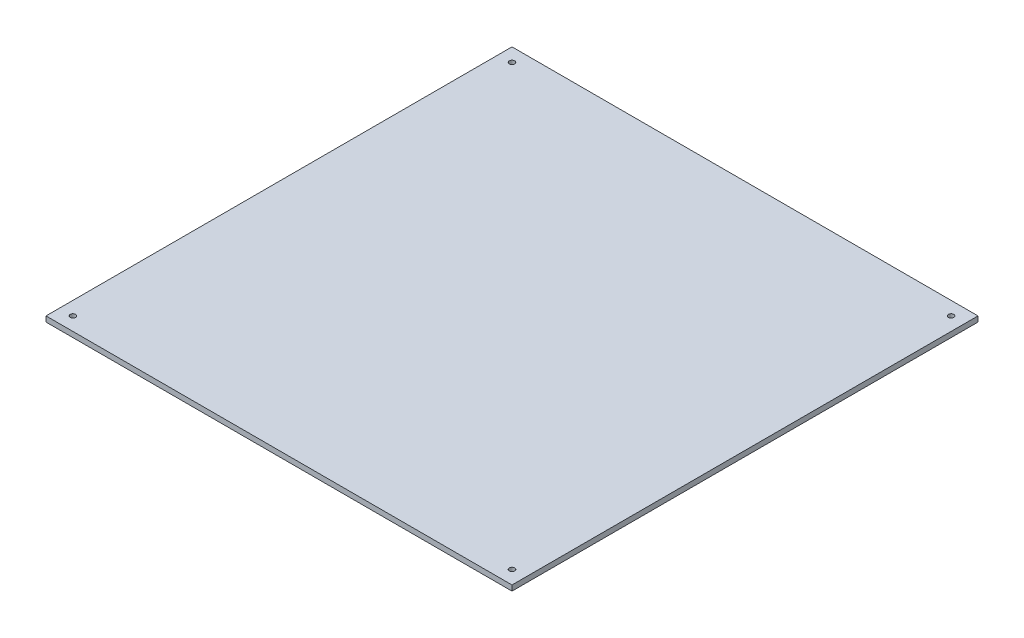
ISO-10303-21;
HEADER;
FILE_DESCRIPTION(('STEP AP214'),'2;1');
FILE_NAME('part.step','',(''),(''),'','','');
FILE_SCHEMA(('AUTOMOTIVE_DESIGN { 1 0 10303 214 1 1 1 1 }'));
ENDSEC;
DATA;
#1=APPLICATION_CONTEXT('core data for automotive mechanical design processes');
#2=APPLICATION_PROTOCOL_DEFINITION('international standard','automotive_design',2000,#1);
#3=PRODUCT_CONTEXT('',#1,'mechanical');
#4=PRODUCT('Part','Part','',(#3));
#5=PRODUCT_RELATED_PRODUCT_CATEGORY('part','',(#4));
#6=PRODUCT_DEFINITION_FORMATION('','',#4);
#7=PRODUCT_DEFINITION_CONTEXT('part definition',#1,'design');
#8=PRODUCT_DEFINITION('design','',#6,#7);
#9=PRODUCT_DEFINITION_SHAPE('','',#8);
#10=(LENGTH_UNIT() NAMED_UNIT(*) SI_UNIT(.MILLI.,.METRE.));
#11=(NAMED_UNIT(*) PLANE_ANGLE_UNIT() SI_UNIT($,.RADIAN.));
#12=(NAMED_UNIT(*) SI_UNIT($,.STERADIAN.) SOLID_ANGLE_UNIT());
#13=UNCERTAINTY_MEASURE_WITH_UNIT(LENGTH_MEASURE(1.E-05),#10,'distance_accuracy_value','');
#14=(GEOMETRIC_REPRESENTATION_CONTEXT(3) GLOBAL_UNCERTAINTY_ASSIGNED_CONTEXT((#13)) GLOBAL_UNIT_ASSIGNED_CONTEXT((#10,
#11,#12)) REPRESENTATION_CONTEXT('',''));
#15=CARTESIAN_POINT('',(0.,0.,0.));
#16=DIRECTION('',(0.,0.,1.));
#17=DIRECTION('',(1.,0.,0.));
#18=AXIS2_PLACEMENT_3D('',#15,#16,#17);
#19=CARTESIAN_POINT('',(0.,3.,0.));
#20=DIRECTION('',(0.,-1.,0.));
#21=DIRECTION('',(0.,0.,-1.));
#22=AXIS2_PLACEMENT_3D('',#19,#20,#21);
#23=PLANE('',#22);
#24=DIRECTION('',(0.,0.,-1.));
#25=VECTOR('',#24,1.);
#26=CARTESIAN_POINT('',(130.,3.,130.));
#27=LINE('',#26,#25);
#28=CARTESIAN_POINT('',(130.,3.,130.));
#29=VERTEX_POINT('',#28);
#30=CARTESIAN_POINT('',(130.,3.,-130.));
#31=VERTEX_POINT('',#30);
#32=EDGE_CURVE('E84',#29,#31,#27,.T.);
#33=ORIENTED_EDGE('',*,*,#32,.T.);
#34=DIRECTION('',(-1.,0.,0.));
#35=VECTOR('',#34,1.);
#36=CARTESIAN_POINT('',(-130.,3.,-130.));
#37=LINE('',#36,#35);
#38=CARTESIAN_POINT('',(-130.,3.,-130.));
#39=VERTEX_POINT('',#38);
#40=EDGE_CURVE('E79',#31,#39,#37,.T.);
#41=ORIENTED_EDGE('',*,*,#40,.T.);
#42=DIRECTION('',(0.,0.,1.));
#43=VECTOR('',#42,1.);
#44=CARTESIAN_POINT('',(-130.,3.,130.));
#45=LINE('',#44,#43);
#46=CARTESIAN_POINT('',(-130.,3.,130.));
#47=VERTEX_POINT('',#46);
#48=EDGE_CURVE('E82',#39,#47,#45,.T.);
#49=ORIENTED_EDGE('',*,*,#48,.T.);
#50=DIRECTION('',(1.,0.,0.));
#51=VECTOR('',#50,1.);
#52=CARTESIAN_POINT('',(-130.,3.,130.));
#53=LINE('',#52,#51);
#54=EDGE_CURVE('E49',#47,#29,#53,.T.);
#55=ORIENTED_EDGE('',*,*,#54,.T.);
#56=EDGE_LOOP('',(#33,#41,#49,#55));
#57=FACE_BOUND('',#56,.T.);
#58=CARTESIAN_POINT('',(-122.5,3.,-122.5));
#59=DIRECTION('',(0.,1.,0.));
#60=DIRECTION('',(0.,0.,1.));
#61=AXIS2_PLACEMENT_3D('',#58,#59,#60);
#62=CIRCLE('',#61,1.5);
#63=CARTESIAN_POINT('',(-122.5,3.,-121.));
#64=VERTEX_POINT('',#63);
#65=EDGE_CURVE('E99',#64,#64,#62,.T.);
#66=ORIENTED_EDGE('',*,*,#65,.F.);
#67=EDGE_LOOP('',(#66));
#68=FACE_BOUND('',#67,.T.);
#69=CARTESIAN_POINT('',(-122.5,3.,122.5));
#70=DIRECTION('',(0.,1.,0.));
#71=DIRECTION('',(0.,0.,1.));
#72=AXIS2_PLACEMENT_3D('',#69,#70,#71);
#73=CIRCLE('',#72,1.5);
#74=CARTESIAN_POINT('',(-122.5,3.,124.));
#75=VERTEX_POINT('',#74);
#76=EDGE_CURVE('E114',#75,#75,#73,.T.);
#77=ORIENTED_EDGE('',*,*,#76,.F.);
#78=EDGE_LOOP('',(#77));
#79=FACE_BOUND('',#78,.T.);
#80=CARTESIAN_POINT('',(122.5,3.,122.5));
#81=DIRECTION('',(0.,1.,0.));
#82=DIRECTION('',(0.,0.,-1.));
#83=AXIS2_PLACEMENT_3D('',#80,#81,#82);
#84=CIRCLE('',#83,1.5);
#85=CARTESIAN_POINT('',(122.5,3.,121.));
#86=VERTEX_POINT('',#85);
#87=EDGE_CURVE('E120',#86,#86,#84,.T.);
#88=ORIENTED_EDGE('',*,*,#87,.F.);
#89=EDGE_LOOP('',(#88));
#90=FACE_BOUND('',#89,.T.);
#91=CARTESIAN_POINT('',(122.5,3.,-122.5));
#92=DIRECTION('',(0.,1.,0.));
#93=DIRECTION('',(0.,0.,-1.));
#94=AXIS2_PLACEMENT_3D('',#91,#92,#93);
#95=CIRCLE('',#94,1.5);
#96=CARTESIAN_POINT('',(122.5,3.,-124.));
#97=VERTEX_POINT('',#96);
#98=EDGE_CURVE('E126',#97,#97,#95,.T.);
#99=ORIENTED_EDGE('',*,*,#98,.F.);
#100=EDGE_LOOP('',(#99));
#101=FACE_BOUND('',#100,.T.);
#102=ADVANCED_FACE('F32',(#57,#68,#79,#90,#101),#23,.F.);
#103=CARTESIAN_POINT('',(0.,0.,0.));
#104=DIRECTION('',(0.,-1.,0.));
#105=DIRECTION('',(0.,0.,-1.));
#106=AXIS2_PLACEMENT_3D('',#103,#104,#105);
#107=PLANE('',#106);
#108=CARTESIAN_POINT('',(122.5,0.,122.5));
#109=DIRECTION('',(0.,1.,0.));
#110=DIRECTION('',(0.,0.,-1.));
#111=AXIS2_PLACEMENT_3D('',#108,#109,#110);
#112=CIRCLE('',#111,1.5);
#113=CARTESIAN_POINT('',(122.5,0.,121.));
#114=VERTEX_POINT('',#113);
#115=EDGE_CURVE('E123',#114,#114,#112,.T.);
#116=ORIENTED_EDGE('',*,*,#115,.T.);
#117=EDGE_LOOP('',(#116));
#118=FACE_BOUND('',#117,.T.);
#119=CARTESIAN_POINT('',(-122.5,0.,-122.5));
#120=DIRECTION('',(0.,1.,0.));
#121=DIRECTION('',(0.,0.,1.));
#122=AXIS2_PLACEMENT_3D('',#119,#120,#121);
#123=CIRCLE('',#122,1.5);
#124=CARTESIAN_POINT('',(-122.5,0.,-121.));
#125=VERTEX_POINT('',#124);
#126=EDGE_CURVE('E111',#125,#125,#123,.T.);
#127=ORIENTED_EDGE('',*,*,#126,.T.);
#128=EDGE_LOOP('',(#127));
#129=FACE_BOUND('',#128,.T.);
#130=DIRECTION('',(0.,0.,-1.));
#131=VECTOR('',#130,1.);
#132=CARTESIAN_POINT('',(130.,0.,130.));
#133=LINE('',#132,#131);
#134=CARTESIAN_POINT('',(130.,0.,130.));
#135=VERTEX_POINT('',#134);
#136=CARTESIAN_POINT('',(130.,0.,-130.));
#137=VERTEX_POINT('',#136);
#138=EDGE_CURVE('E96',#135,#137,#133,.T.);
#139=ORIENTED_EDGE('',*,*,#138,.F.);
#140=DIRECTION('',(1.,0.,0.));
#141=VECTOR('',#140,1.);
#142=CARTESIAN_POINT('',(-130.,0.,130.));
#143=LINE('',#142,#141);
#144=CARTESIAN_POINT('',(-130.,0.,130.));
#145=VERTEX_POINT('',#144);
#146=EDGE_CURVE('E72',#145,#135,#143,.T.);
#147=ORIENTED_EDGE('',*,*,#146,.F.);
#148=DIRECTION('',(0.,0.,1.));
#149=VECTOR('',#148,1.);
#150=CARTESIAN_POINT('',(-130.,0.,130.));
#151=LINE('',#150,#149);
#152=CARTESIAN_POINT('',(-130.,0.,-130.));
#153=VERTEX_POINT('',#152);
#154=EDGE_CURVE('E66',#153,#145,#151,.T.);
#155=ORIENTED_EDGE('',*,*,#154,.F.);
#156=DIRECTION('',(-1.,0.,0.));
#157=VECTOR('',#156,1.);
#158=CARTESIAN_POINT('',(-130.,0.,-130.));
#159=LINE('',#158,#157);
#160=EDGE_CURVE('E88',#137,#153,#159,.T.);
#161=ORIENTED_EDGE('',*,*,#160,.F.);
#162=EDGE_LOOP('',(#139,#147,#155,#161));
#163=FACE_BOUND('',#162,.T.);
#164=CARTESIAN_POINT('',(-122.5,0.,122.5));
#165=DIRECTION('',(0.,1.,0.));
#166=DIRECTION('',(0.,0.,1.));
#167=AXIS2_PLACEMENT_3D('',#164,#165,#166);
#168=CIRCLE('',#167,1.5);
#169=CARTESIAN_POINT('',(-122.5,0.,124.));
#170=VERTEX_POINT('',#169);
#171=EDGE_CURVE('E117',#170,#170,#168,.T.);
#172=ORIENTED_EDGE('',*,*,#171,.T.);
#173=EDGE_LOOP('',(#172));
#174=FACE_BOUND('',#173,.T.);
#175=CARTESIAN_POINT('',(122.5,0.,-122.5));
#176=DIRECTION('',(0.,1.,0.));
#177=DIRECTION('',(0.,0.,-1.));
#178=AXIS2_PLACEMENT_3D('',#175,#176,#177);
#179=CIRCLE('',#178,1.5);
#180=CARTESIAN_POINT('',(122.5,0.,-124.));
#181=VERTEX_POINT('',#180);
#182=EDGE_CURVE('E129',#181,#181,#179,.T.);
#183=ORIENTED_EDGE('',*,*,#182,.T.);
#184=EDGE_LOOP('',(#183));
#185=FACE_BOUND('',#184,.T.);
#186=ADVANCED_FACE('F107',(#118,#129,#163,#174,#185),#107,.T.);
#187=CARTESIAN_POINT('',(130.,3.,130.));
#188=DIRECTION('',(-1.,0.,0.));
#189=DIRECTION('',(0.,0.,1.));
#190=AXIS2_PLACEMENT_3D('',#187,#188,#189);
#191=PLANE('',#190);
#192=ORIENTED_EDGE('',*,*,#138,.T.);
#193=DIRECTION('',(0.,-1.,0.));
#194=VECTOR('',#193,1.);
#195=CARTESIAN_POINT('',(130.,3.,-130.));
#196=LINE('',#195,#194);
#197=EDGE_CURVE('E11',#31,#137,#196,.T.);
#198=ORIENTED_EDGE('',*,*,#197,.F.);
#199=ORIENTED_EDGE('',*,*,#32,.F.);
#200=DIRECTION('',(0.,-1.,0.));
#201=VECTOR('',#200,1.);
#202=CARTESIAN_POINT('',(130.,3.,130.));
#203=LINE('',#202,#201);
#204=EDGE_CURVE('E92',#29,#135,#203,.T.);
#205=ORIENTED_EDGE('',*,*,#204,.T.);
#206=EDGE_LOOP('',(#192,#198,#199,#205));
#207=FACE_BOUND('',#206,.T.);
#208=ADVANCED_FACE('F34',(#207),#191,.F.);
#209=CARTESIAN_POINT('',(-130.,3.,-130.));
#210=DIRECTION('',(0.,0.,1.));
#211=DIRECTION('',(1.,0.,0.));
#212=AXIS2_PLACEMENT_3D('',#209,#210,#211);
#213=PLANE('',#212);
#214=ORIENTED_EDGE('',*,*,#160,.T.);
#215=DIRECTION('',(0.,-1.,0.));
#216=VECTOR('',#215,1.);
#217=CARTESIAN_POINT('',(-130.,3.,-130.));
#218=LINE('',#217,#216);
#219=EDGE_CURVE('E41',#39,#153,#218,.T.);
#220=ORIENTED_EDGE('',*,*,#219,.F.);
#221=ORIENTED_EDGE('',*,*,#40,.F.);
#222=ORIENTED_EDGE('',*,*,#197,.T.);
#223=EDGE_LOOP('',(#214,#220,#221,#222));
#224=FACE_BOUND('',#223,.T.);
#225=ADVANCED_FACE('F87',(#224),#213,.F.);
#226=CARTESIAN_POINT('',(-130.,3.,130.));
#227=DIRECTION('',(1.,0.,0.));
#228=DIRECTION('',(0.,0.,-1.));
#229=AXIS2_PLACEMENT_3D('',#226,#227,#228);
#230=PLANE('',#229);
#231=ORIENTED_EDGE('',*,*,#154,.T.);
#232=DIRECTION('',(0.,-1.,0.));
#233=VECTOR('',#232,1.);
#234=CARTESIAN_POINT('',(-130.,3.,130.));
#235=LINE('',#234,#233);
#236=EDGE_CURVE('E89',#47,#145,#235,.T.);
#237=ORIENTED_EDGE('',*,*,#236,.F.);
#238=ORIENTED_EDGE('',*,*,#48,.F.);
#239=ORIENTED_EDGE('',*,*,#219,.T.);
#240=EDGE_LOOP('',(#231,#237,#238,#239));
#241=FACE_BOUND('',#240,.T.);
#242=ADVANCED_FACE('F90',(#241),#230,.F.);
#243=CARTESIAN_POINT('',(-130.,3.,130.));
#244=DIRECTION('',(0.,0.,-1.));
#245=DIRECTION('',(-1.,0.,0.));
#246=AXIS2_PLACEMENT_3D('',#243,#244,#245);
#247=PLANE('',#246);
#248=ORIENTED_EDGE('',*,*,#146,.T.);
#249=ORIENTED_EDGE('',*,*,#204,.F.);
#250=ORIENTED_EDGE('',*,*,#54,.F.);
#251=ORIENTED_EDGE('',*,*,#236,.T.);
#252=EDGE_LOOP('',(#248,#249,#250,#251));
#253=FACE_BOUND('',#252,.T.);
#254=ADVANCED_FACE('F104',(#253),#247,.F.);
#255=CARTESIAN_POINT('',(-122.5,3.,-122.5));
#256=DIRECTION('',(0.,-1.,0.));
#257=DIRECTION('',(0.,0.,-1.));
#258=AXIS2_PLACEMENT_3D('',#255,#256,#257);
#259=CYLINDRICAL_SURFACE('',#258,1.5);
#260=ORIENTED_EDGE('',*,*,#65,.T.);
#261=EDGE_LOOP('',(#260));
#262=FACE_BOUND('',#261,.T.);
#263=ORIENTED_EDGE('',*,*,#126,.F.);
#264=EDGE_LOOP('',(#263));
#265=FACE_BOUND('',#264,.T.);
#266=ADVANCED_FACE('F146',(#262,#265),#259,.F.);
#267=CARTESIAN_POINT('',(-122.5,3.,122.5));
#268=DIRECTION('',(0.,-1.,0.));
#269=DIRECTION('',(0.,0.,-1.));
#270=AXIS2_PLACEMENT_3D('',#267,#268,#269);
#271=CYLINDRICAL_SURFACE('',#270,1.5);
#272=ORIENTED_EDGE('',*,*,#76,.T.);
#273=EDGE_LOOP('',(#272));
#274=FACE_BOUND('',#273,.T.);
#275=ORIENTED_EDGE('',*,*,#171,.F.);
#276=EDGE_LOOP('',(#275));
#277=FACE_BOUND('',#276,.T.);
#278=ADVANCED_FACE('F192',(#274,#277),#271,.F.);
#279=CARTESIAN_POINT('',(122.5,3.,122.5));
#280=DIRECTION('',(0.,-1.,0.));
#281=DIRECTION('',(0.,0.,-1.));
#282=AXIS2_PLACEMENT_3D('',#279,#280,#281);
#283=CYLINDRICAL_SURFACE('',#282,1.5);
#284=ORIENTED_EDGE('',*,*,#87,.T.);
#285=EDGE_LOOP('',(#284));
#286=FACE_BOUND('',#285,.T.);
#287=ORIENTED_EDGE('',*,*,#115,.F.);
#288=EDGE_LOOP('',(#287));
#289=FACE_BOUND('',#288,.T.);
#290=ADVANCED_FACE('F200',(#286,#289),#283,.F.);
#291=CARTESIAN_POINT('',(122.5,3.,-122.5));
#292=DIRECTION('',(0.,-1.,0.));
#293=DIRECTION('',(0.,0.,-1.));
#294=AXIS2_PLACEMENT_3D('',#291,#292,#293);
#295=CYLINDRICAL_SURFACE('',#294,1.5);
#296=ORIENTED_EDGE('',*,*,#98,.T.);
#297=EDGE_LOOP('',(#296));
#298=FACE_BOUND('',#297,.T.);
#299=ORIENTED_EDGE('',*,*,#182,.F.);
#300=EDGE_LOOP('',(#299));
#301=FACE_BOUND('',#300,.T.);
#302=ADVANCED_FACE('F135',(#298,#301),#295,.F.);
#303=CLOSED_SHELL('',(#102,#186,#208,#225,#242,#254,#266,#278,#290,#302));
#304=MANIFOLD_SOLID_BREP('B2',#303);
#305=ADVANCED_BREP_SHAPE_REPRESENTATION('',(#18,#304),#14);
#306=SHAPE_DEFINITION_REPRESENTATION(#9,#305);
ENDSEC;
END-ISO-10303-21;
